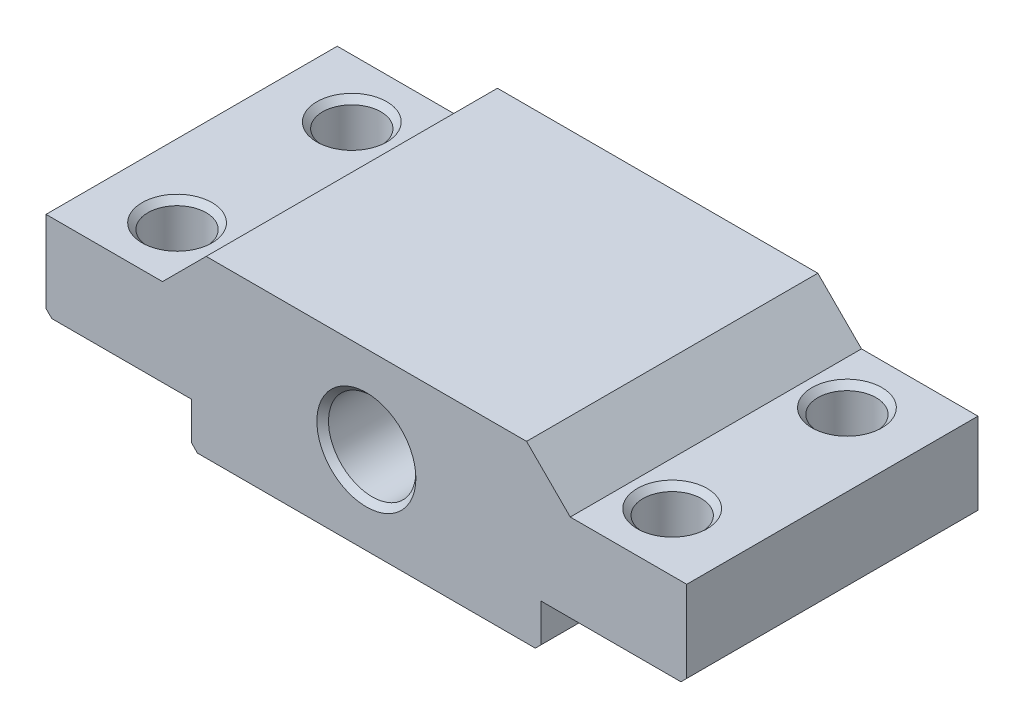
ISO-10303-21;
HEADER;
FILE_DESCRIPTION(('STEP AP214'),'2;1');
FILE_NAME('part.step','',(''),(''),'','','');
FILE_SCHEMA(('AUTOMOTIVE_DESIGN { 1 0 10303 214 1 1 1 1 }'));
ENDSEC;
DATA;
#1=APPLICATION_CONTEXT('core data for automotive mechanical design processes');
#2=APPLICATION_PROTOCOL_DEFINITION('international standard','automotive_design',2000,#1);
#3=PRODUCT_CONTEXT('',#1,'mechanical');
#4=PRODUCT('Part','Part','',(#3));
#5=PRODUCT_RELATED_PRODUCT_CATEGORY('part','',(#4));
#6=PRODUCT_DEFINITION_FORMATION('','',#4);
#7=PRODUCT_DEFINITION_CONTEXT('part definition',#1,'design');
#8=PRODUCT_DEFINITION('design','',#6,#7);
#9=PRODUCT_DEFINITION_SHAPE('','',#8);
#10=(LENGTH_UNIT() NAMED_UNIT(*) SI_UNIT(.MILLI.,.METRE.));
#11=(NAMED_UNIT(*) PLANE_ANGLE_UNIT() SI_UNIT($,.RADIAN.));
#12=(NAMED_UNIT(*) SI_UNIT($,.STERADIAN.) SOLID_ANGLE_UNIT());
#13=UNCERTAINTY_MEASURE_WITH_UNIT(LENGTH_MEASURE(1.E-05),#10,'distance_accuracy_value','');
#14=(GEOMETRIC_REPRESENTATION_CONTEXT(3) GLOBAL_UNCERTAINTY_ASSIGNED_CONTEXT((#13)) GLOBAL_UNIT_ASSIGNED_CONTEXT((#10,
#11,#12)) REPRESENTATION_CONTEXT('',''));
#15=CARTESIAN_POINT('',(0.,0.,0.));
#16=DIRECTION('',(0.,0.,1.));
#17=DIRECTION('',(1.,0.,0.));
#18=AXIS2_PLACEMENT_3D('',#15,#16,#17);
#19=CARTESIAN_POINT('',(-55.,7.5,25.));
#20=DIRECTION('',(0.,-1.,0.));
#21=DIRECTION('',(0.,0.,-1.));
#22=AXIS2_PLACEMENT_3D('',#19,#20,#21);
#23=PLANE('',#22);
#24=CARTESIAN_POINT('',(-42.5,7.5,-15.));
#25=DIRECTION('',(0.,-1.,0.));
#26=DIRECTION('',(0.,0.,-1.));
#27=AXIS2_PLACEMENT_3D('',#24,#25,#26);
#28=CIRCLE('',#27,6.00000000000002);
#29=CARTESIAN_POINT('',(-42.5,7.5,-21.));
#30=VERTEX_POINT('',#29);
#31=EDGE_CURVE('E278',#30,#30,#28,.T.);
#32=ORIENTED_EDGE('',*,*,#31,.T.);
#33=EDGE_LOOP('',(#32));
#34=FACE_BOUND('',#33,.T.);
#35=CARTESIAN_POINT('',(-42.5,7.5,15.));
#36=DIRECTION('',(0.,-1.,0.));
#37=DIRECTION('',(0.,0.,-1.));
#38=AXIS2_PLACEMENT_3D('',#35,#36,#37);
#39=CIRCLE('',#38,6.00000000000002);
#40=CARTESIAN_POINT('',(-42.5,7.5,8.99999999999998));
#41=VERTEX_POINT('',#40);
#42=EDGE_CURVE('E274',#41,#41,#39,.T.);
#43=ORIENTED_EDGE('',*,*,#42,.T.);
#44=EDGE_LOOP('',(#43));
#45=FACE_BOUND('',#44,.T.);
#46=DIRECTION('',(-1.,0.,0.));
#47=VECTOR('',#46,1.);
#48=CARTESIAN_POINT('',(-55.,7.5,25.));
#49=LINE('',#48,#47);
#50=CARTESIAN_POINT('',(-35.0000000000002,7.5,25.));
#51=VERTEX_POINT('',#50);
#52=CARTESIAN_POINT('',(-55.,7.5,25.));
#53=VERTEX_POINT('',#52);
#54=EDGE_CURVE('E163',#51,#53,#49,.T.);
#55=ORIENTED_EDGE('',*,*,#54,.F.);
#56=DIRECTION('',(0.,0.,-1.));
#57=VECTOR('',#56,1.);
#58=CARTESIAN_POINT('',(-35.0000000000002,7.5,-25.));
#59=LINE('',#58,#57);
#60=CARTESIAN_POINT('',(-35.0000000000002,7.5,-25.));
#61=VERTEX_POINT('',#60);
#62=EDGE_CURVE('E193',#51,#61,#59,.T.);
#63=ORIENTED_EDGE('',*,*,#62,.T.);
#64=DIRECTION('',(-1.,0.,0.));
#65=VECTOR('',#64,1.);
#66=CARTESIAN_POINT('',(-55.,7.5,-25.));
#67=LINE('',#66,#65);
#68=CARTESIAN_POINT('',(-55.,7.5,-25.));
#69=VERTEX_POINT('',#68);
#70=EDGE_CURVE('E185',#61,#69,#67,.T.);
#71=ORIENTED_EDGE('',*,*,#70,.T.);
#72=DIRECTION('',(0.,0.,-1.));
#73=VECTOR('',#72,1.);
#74=CARTESIAN_POINT('',(-55.,7.5,25.));
#75=LINE('',#74,#73);
#76=EDGE_CURVE('E177',#53,#69,#75,.T.);
#77=ORIENTED_EDGE('',*,*,#76,.F.);
#78=EDGE_LOOP('',(#55,#63,#71,#77));
#79=FACE_BOUND('',#78,.T.);
#80=ADVANCED_FACE('F47',(#34,#45,#79),#23,.F.);
#81=CARTESIAN_POINT('',(25.,7.5,25.));
#82=DIRECTION('',(0.,-1.,0.));
#83=DIRECTION('',(0.,0.,-1.));
#84=AXIS2_PLACEMENT_3D('',#81,#82,#83);
#85=PLANE('',#84);
#86=CARTESIAN_POINT('',(42.5,7.5,15.));
#87=DIRECTION('',(0.,-1.,0.));
#88=DIRECTION('',(0.,0.,-1.));
#89=AXIS2_PLACEMENT_3D('',#86,#87,#88);
#90=CIRCLE('',#89,6.00000000000002);
#91=CARTESIAN_POINT('',(42.5,7.5,8.99999999999998));
#92=VERTEX_POINT('',#91);
#93=EDGE_CURVE('E262',#92,#92,#90,.T.);
#94=ORIENTED_EDGE('',*,*,#93,.T.);
#95=EDGE_LOOP('',(#94));
#96=FACE_BOUND('',#95,.T.);
#97=CARTESIAN_POINT('',(42.5,7.5,-15.));
#98=DIRECTION('',(0.,-1.,0.));
#99=DIRECTION('',(0.,0.,-1.));
#100=AXIS2_PLACEMENT_3D('',#97,#98,#99);
#101=CIRCLE('',#100,6.00000000000002);
#102=CARTESIAN_POINT('',(42.5,7.5,-21.));
#103=VERTEX_POINT('',#102);
#104=EDGE_CURVE('E258',#103,#103,#101,.T.);
#105=ORIENTED_EDGE('',*,*,#104,.T.);
#106=EDGE_LOOP('',(#105));
#107=FACE_BOUND('',#106,.T.);
#108=DIRECTION('',(-1.,0.,0.));
#109=VECTOR('',#108,1.);
#110=CARTESIAN_POINT('',(25.,7.5,-25.));
#111=LINE('',#110,#109);
#112=CARTESIAN_POINT('',(55.,7.5,-25.));
#113=VERTEX_POINT('',#112);
#114=CARTESIAN_POINT('',(35.0000000000001,7.5,-25.));
#115=VERTEX_POINT('',#114);
#116=EDGE_CURVE('E458',#113,#115,#111,.T.);
#117=ORIENTED_EDGE('',*,*,#116,.T.);
#118=DIRECTION('',(0.,0.,1.));
#119=VECTOR('',#118,1.);
#120=CARTESIAN_POINT('',(35.0000000000001,7.5,25.));
#121=LINE('',#120,#119);
#122=CARTESIAN_POINT('',(35.0000000000001,7.5,25.));
#123=VERTEX_POINT('',#122);
#124=EDGE_CURVE('E188',#115,#123,#121,.T.);
#125=ORIENTED_EDGE('',*,*,#124,.T.);
#126=DIRECTION('',(-1.,0.,0.));
#127=VECTOR('',#126,1.);
#128=CARTESIAN_POINT('',(25.,7.5,25.));
#129=LINE('',#128,#127);
#130=CARTESIAN_POINT('',(55.,7.5,25.));
#131=VERTEX_POINT('',#130);
#132=EDGE_CURVE('E496',#131,#123,#129,.T.);
#133=ORIENTED_EDGE('',*,*,#132,.F.);
#134=DIRECTION('',(0.,0.,-1.));
#135=VECTOR('',#134,1.);
#136=CARTESIAN_POINT('',(55.,7.5,25.));
#137=LINE('',#136,#135);
#138=EDGE_CURVE('E464',#131,#113,#137,.T.);
#139=ORIENTED_EDGE('',*,*,#138,.T.);
#140=EDGE_LOOP('',(#117,#125,#133,#139));
#141=FACE_BOUND('',#140,.T.);
#142=ADVANCED_FACE('F305',(#96,#107,#141),#85,.F.);
#143=CARTESIAN_POINT('',(-55.,-6.5,25.));
#144=DIRECTION('',(1.,0.,0.));
#145=DIRECTION('',(0.,0.,-1.));
#146=AXIS2_PLACEMENT_3D('',#143,#144,#145);
#147=PLANE('',#146);
#148=DIRECTION('',(0.,-1.,0.));
#149=VECTOR('',#148,1.);
#150=CARTESIAN_POINT('',(-55.,-6.5,-25.));
#151=LINE('',#150,#149);
#152=CARTESIAN_POINT('',(-55.,-6.5,-25.));
#153=VERTEX_POINT('',#152);
#154=EDGE_CURVE('E531',#69,#153,#151,.T.);
#155=ORIENTED_EDGE('',*,*,#154,.T.);
#156=DIRECTION('',(0.,0.,-1.));
#157=VECTOR('',#156,1.);
#158=CARTESIAN_POINT('',(-55.,-6.5,25.));
#159=LINE('',#158,#157);
#160=CARTESIAN_POINT('',(-55.,-6.5,25.));
#161=VERTEX_POINT('',#160);
#162=EDGE_CURVE('E179',#161,#153,#159,.T.);
#163=ORIENTED_EDGE('',*,*,#162,.F.);
#164=DIRECTION('',(0.,-1.,0.));
#165=VECTOR('',#164,1.);
#166=CARTESIAN_POINT('',(-55.,-6.5,25.));
#167=LINE('',#166,#165);
#168=EDGE_CURVE('E166',#53,#161,#167,.T.);
#169=ORIENTED_EDGE('',*,*,#168,.F.);
#170=ORIENTED_EDGE('',*,*,#76,.T.);
#171=EDGE_LOOP('',(#155,#163,#169,#170));
#172=FACE_BOUND('',#171,.T.);
#173=ADVANCED_FACE('F176',(#172),#147,.F.);
#174=CARTESIAN_POINT('',(-54.,-7.5,25.));
#175=DIRECTION('',(0.707106781186549,0.707106781186546,0.));
#176=DIRECTION('',(-0.707106781186546,0.707106781186549,0.));
#177=AXIS2_PLACEMENT_3D('',#174,#175,#176);
#178=PLANE('',#177);
#179=DIRECTION('',(0.707106781186546,-0.707106781186549,0.));
#180=VECTOR('',#179,1.);
#181=CARTESIAN_POINT('',(-54.,-7.5,-25.));
#182=LINE('',#181,#180);
#183=CARTESIAN_POINT('',(-54.,-7.5,-25.));
#184=VERTEX_POINT('',#183);
#185=EDGE_CURVE('E422',#153,#184,#182,.T.);
#186=ORIENTED_EDGE('',*,*,#185,.T.);
#187=DIRECTION('',(0.,0.,-1.));
#188=VECTOR('',#187,1.);
#189=CARTESIAN_POINT('',(-54.,-7.5,25.));
#190=LINE('',#189,#188);
#191=CARTESIAN_POINT('',(-54.,-7.5,25.));
#192=VERTEX_POINT('',#191);
#193=EDGE_CURVE('E195',#192,#184,#190,.T.);
#194=ORIENTED_EDGE('',*,*,#193,.F.);
#195=DIRECTION('',(0.707106781186546,-0.707106781186549,0.));
#196=VECTOR('',#195,1.);
#197=CARTESIAN_POINT('',(-54.,-7.5,25.));
#198=LINE('',#197,#196);
#199=EDGE_CURVE('E182',#161,#192,#198,.T.);
#200=ORIENTED_EDGE('',*,*,#199,.F.);
#201=ORIENTED_EDGE('',*,*,#162,.T.);
#202=EDGE_LOOP('',(#186,#194,#200,#201));
#203=FACE_BOUND('',#202,.T.);
#204=ADVANCED_FACE('F405',(#203),#178,.F.);
#205=CARTESIAN_POINT('',(-30.,-7.5,25.));
#206=DIRECTION('',(0.,1.,0.));
#207=DIRECTION('',(-1.,0.,0.));
#208=AXIS2_PLACEMENT_3D('',#205,#206,#207);
#209=PLANE('',#208);
#210=CARTESIAN_POINT('',(-42.5,-7.5,-15.));
#211=DIRECTION('',(0.,1.,0.));
#212=DIRECTION('',(-1.,0.,0.));
#213=AXIS2_PLACEMENT_3D('',#210,#211,#212);
#214=CIRCLE('',#213,6.00000000000003);
#215=CARTESIAN_POINT('',(-48.5,-7.5,-15.));
#216=VERTEX_POINT('',#215);
#217=EDGE_CURVE('E286',#216,#216,#214,.T.);
#218=ORIENTED_EDGE('',*,*,#217,.T.);
#219=EDGE_LOOP('',(#218));
#220=FACE_BOUND('',#219,.T.);
#221=CARTESIAN_POINT('',(-42.5,-7.5,15.));
#222=DIRECTION('',(0.,1.,0.));
#223=DIRECTION('',(-1.,0.,0.));
#224=AXIS2_PLACEMENT_3D('',#221,#222,#223);
#225=CIRCLE('',#224,6.00000000000003);
#226=CARTESIAN_POINT('',(-48.5,-7.5,15.));
#227=VERTEX_POINT('',#226);
#228=EDGE_CURVE('E282',#227,#227,#225,.T.);
#229=ORIENTED_EDGE('',*,*,#228,.T.);
#230=EDGE_LOOP('',(#229));
#231=FACE_BOUND('',#230,.T.);
#232=DIRECTION('',(1.,0.,0.));
#233=VECTOR('',#232,1.);
#234=CARTESIAN_POINT('',(-30.,-7.5,-25.));
#235=LINE('',#234,#233);
#236=CARTESIAN_POINT('',(-30.,-7.5,-25.));
#237=VERTEX_POINT('',#236);
#238=EDGE_CURVE('E412',#184,#237,#235,.T.);
#239=ORIENTED_EDGE('',*,*,#238,.T.);
#240=DIRECTION('',(0.,0.,-1.));
#241=VECTOR('',#240,1.);
#242=CARTESIAN_POINT('',(-30.,-7.5,25.));
#243=LINE('',#242,#241);
#244=CARTESIAN_POINT('',(-30.,-7.5,25.));
#245=VERTEX_POINT('',#244);
#246=EDGE_CURVE('E415',#245,#237,#243,.T.);
#247=ORIENTED_EDGE('',*,*,#246,.F.);
#248=DIRECTION('',(1.,0.,0.));
#249=VECTOR('',#248,1.);
#250=CARTESIAN_POINT('',(-30.,-7.5,25.));
#251=LINE('',#250,#249);
#252=EDGE_CURVE('E523',#192,#245,#251,.T.);
#253=ORIENTED_EDGE('',*,*,#252,.F.);
#254=ORIENTED_EDGE('',*,*,#193,.T.);
#255=EDGE_LOOP('',(#239,#247,#253,#254));
#256=FACE_BOUND('',#255,.T.);
#257=ADVANCED_FACE('F402',(#220,#231,#256),#209,.F.);
#258=CARTESIAN_POINT('',(-30.,-14.,25.));
#259=DIRECTION('',(1.,0.,0.));
#260=DIRECTION('',(0.,0.,-1.));
#261=AXIS2_PLACEMENT_3D('',#258,#259,#260);
#262=PLANE('',#261);
#263=DIRECTION('',(0.,-1.,0.));
#264=VECTOR('',#263,1.);
#265=CARTESIAN_POINT('',(-30.,-14.,-25.));
#266=LINE('',#265,#264);
#267=CARTESIAN_POINT('',(-30.,-14.,-25.));
#268=VERTEX_POINT('',#267);
#269=EDGE_CURVE('E421',#237,#268,#266,.T.);
#270=ORIENTED_EDGE('',*,*,#269,.T.);
#271=DIRECTION('',(0.,0.,-1.));
#272=VECTOR('',#271,1.);
#273=CARTESIAN_POINT('',(-30.,-14.,25.));
#274=LINE('',#273,#272);
#275=CARTESIAN_POINT('',(-30.,-14.,25.));
#276=VERTEX_POINT('',#275);
#277=EDGE_CURVE('E429',#276,#268,#274,.T.);
#278=ORIENTED_EDGE('',*,*,#277,.F.);
#279=DIRECTION('',(0.,-1.,0.));
#280=VECTOR('',#279,1.);
#281=CARTESIAN_POINT('',(-30.,-14.,25.));
#282=LINE('',#281,#280);
#283=EDGE_CURVE('E427',#245,#276,#282,.T.);
#284=ORIENTED_EDGE('',*,*,#283,.F.);
#285=ORIENTED_EDGE('',*,*,#246,.T.);
#286=EDGE_LOOP('',(#270,#278,#284,#285));
#287=FACE_BOUND('',#286,.T.);
#288=ADVANCED_FACE('F404',(#287),#262,.F.);
#289=CARTESIAN_POINT('',(-29.,-15.,25.));
#290=DIRECTION('',(0.707106781186546,0.707106781186549,0.));
#291=DIRECTION('',(-0.707106781186549,0.707106781186546,0.));
#292=AXIS2_PLACEMENT_3D('',#289,#290,#291);
#293=PLANE('',#292);
#294=DIRECTION('',(0.707106781186549,-0.707106781186546,0.));
#295=VECTOR('',#294,1.);
#296=CARTESIAN_POINT('',(-29.,-15.,-25.));
#297=LINE('',#296,#295);
#298=CARTESIAN_POINT('',(-29.,-15.,-25.));
#299=VERTEX_POINT('',#298);
#300=EDGE_CURVE('E433',#268,#299,#297,.T.);
#301=ORIENTED_EDGE('',*,*,#300,.T.);
#302=DIRECTION('',(0.,0.,-1.));
#303=VECTOR('',#302,1.);
#304=CARTESIAN_POINT('',(-29.,-15.,25.));
#305=LINE('',#304,#303);
#306=CARTESIAN_POINT('',(-29.,-15.,25.));
#307=VERTEX_POINT('',#306);
#308=EDGE_CURVE('E488',#307,#299,#305,.T.);
#309=ORIENTED_EDGE('',*,*,#308,.F.);
#310=DIRECTION('',(0.707106781186549,-0.707106781186546,0.));
#311=VECTOR('',#310,1.);
#312=CARTESIAN_POINT('',(-29.,-15.,25.));
#313=LINE('',#312,#311);
#314=EDGE_CURVE('E518',#276,#307,#313,.T.);
#315=ORIENTED_EDGE('',*,*,#314,.F.);
#316=ORIENTED_EDGE('',*,*,#277,.T.);
#317=EDGE_LOOP('',(#301,#309,#315,#316));
#318=FACE_BOUND('',#317,.T.);
#319=ADVANCED_FACE('F575',(#318),#293,.F.);
#320=CARTESIAN_POINT('',(29.,-15.,25.));
#321=DIRECTION('',(0.,1.,0.));
#322=DIRECTION('',(0.,0.,1.));
#323=AXIS2_PLACEMENT_3D('',#320,#321,#322);
#324=PLANE('',#323);
#325=DIRECTION('',(1.,0.,0.));
#326=VECTOR('',#325,1.);
#327=CARTESIAN_POINT('',(29.,-15.,-25.));
#328=LINE('',#327,#326);
#329=CARTESIAN_POINT('',(29.,-15.,-25.));
#330=VERTEX_POINT('',#329);
#331=EDGE_CURVE('E437',#299,#330,#328,.T.);
#332=ORIENTED_EDGE('',*,*,#331,.T.);
#333=DIRECTION('',(0.,0.,-1.));
#334=VECTOR('',#333,1.);
#335=CARTESIAN_POINT('',(29.,-15.,25.));
#336=LINE('',#335,#334);
#337=CARTESIAN_POINT('',(29.,-15.,25.));
#338=VERTEX_POINT('',#337);
#339=EDGE_CURVE('E484',#338,#330,#336,.T.);
#340=ORIENTED_EDGE('',*,*,#339,.F.);
#341=DIRECTION('',(1.,0.,0.));
#342=VECTOR('',#341,1.);
#343=CARTESIAN_POINT('',(29.,-15.,25.));
#344=LINE('',#343,#342);
#345=EDGE_CURVE('E515',#307,#338,#344,.T.);
#346=ORIENTED_EDGE('',*,*,#345,.F.);
#347=ORIENTED_EDGE('',*,*,#308,.T.);
#348=EDGE_LOOP('',(#332,#340,#346,#347));
#349=FACE_BOUND('',#348,.T.);
#350=ADVANCED_FACE('F571',(#349),#324,.F.);
#351=CARTESIAN_POINT('',(30.,-14.,25.));
#352=DIRECTION('',(-0.707106781186549,0.707106781186546,0.));
#353=DIRECTION('',(-0.707106781186546,-0.707106781186549,0.));
#354=AXIS2_PLACEMENT_3D('',#351,#352,#353);
#355=PLANE('',#354);
#356=DIRECTION('',(0.707106781186546,0.707106781186549,0.));
#357=VECTOR('',#356,1.);
#358=CARTESIAN_POINT('',(30.,-14.,-25.));
#359=LINE('',#358,#357);
#360=CARTESIAN_POINT('',(30.,-14.,-25.));
#361=VERTEX_POINT('',#360);
#362=EDGE_CURVE('E443',#330,#361,#359,.T.);
#363=ORIENTED_EDGE('',*,*,#362,.T.);
#364=DIRECTION('',(0.,0.,-1.));
#365=VECTOR('',#364,1.);
#366=CARTESIAN_POINT('',(30.,-14.,25.));
#367=LINE('',#366,#365);
#368=CARTESIAN_POINT('',(30.,-14.,25.));
#369=VERTEX_POINT('',#368);
#370=EDGE_CURVE('E480',#369,#361,#367,.T.);
#371=ORIENTED_EDGE('',*,*,#370,.F.);
#372=DIRECTION('',(0.707106781186546,0.707106781186549,0.));
#373=VECTOR('',#372,1.);
#374=CARTESIAN_POINT('',(30.,-14.,25.));
#375=LINE('',#374,#373);
#376=EDGE_CURVE('E512',#338,#369,#375,.T.);
#377=ORIENTED_EDGE('',*,*,#376,.F.);
#378=ORIENTED_EDGE('',*,*,#339,.T.);
#379=EDGE_LOOP('',(#363,#371,#377,#378));
#380=FACE_BOUND('',#379,.T.);
#381=ADVANCED_FACE('F566',(#380),#355,.F.);
#382=CARTESIAN_POINT('',(30.,-7.5,25.));
#383=DIRECTION('',(-1.,0.,0.));
#384=DIRECTION('',(0.,0.,1.));
#385=AXIS2_PLACEMENT_3D('',#382,#383,#384);
#386=PLANE('',#385);
#387=DIRECTION('',(0.,1.,0.));
#388=VECTOR('',#387,1.);
#389=CARTESIAN_POINT('',(30.,-7.5,-25.));
#390=LINE('',#389,#388);
#391=CARTESIAN_POINT('',(30.,-7.5,-25.));
#392=VERTEX_POINT('',#391);
#393=EDGE_CURVE('E446',#361,#392,#390,.T.);
#394=ORIENTED_EDGE('',*,*,#393,.T.);
#395=DIRECTION('',(0.,0.,-1.));
#396=VECTOR('',#395,1.);
#397=CARTESIAN_POINT('',(30.,-7.5,25.));
#398=LINE('',#397,#396);
#399=CARTESIAN_POINT('',(30.,-7.5,25.));
#400=VERTEX_POINT('',#399);
#401=EDGE_CURVE('E476',#400,#392,#398,.T.);
#402=ORIENTED_EDGE('',*,*,#401,.F.);
#403=DIRECTION('',(0.,1.,0.));
#404=VECTOR('',#403,1.);
#405=CARTESIAN_POINT('',(30.,-7.5,25.));
#406=LINE('',#405,#404);
#407=EDGE_CURVE('E509',#369,#400,#406,.T.);
#408=ORIENTED_EDGE('',*,*,#407,.F.);
#409=ORIENTED_EDGE('',*,*,#370,.T.);
#410=EDGE_LOOP('',(#394,#402,#408,#409));
#411=FACE_BOUND('',#410,.T.);
#412=ADVANCED_FACE('F562',(#411),#386,.F.);
#413=CARTESIAN_POINT('',(54.,-7.5,25.));
#414=DIRECTION('',(0.,1.,0.));
#415=DIRECTION('',(-1.,0.,0.));
#416=AXIS2_PLACEMENT_3D('',#413,#414,#415);
#417=PLANE('',#416);
#418=CARTESIAN_POINT('',(42.5,-7.5,-15.));
#419=DIRECTION('',(0.,1.,0.));
#420=DIRECTION('',(-1.,0.,0.));
#421=AXIS2_PLACEMENT_3D('',#418,#419,#420);
#422=CIRCLE('',#421,6.00000000000003);
#423=CARTESIAN_POINT('',(36.5,-7.5,-15.));
#424=VERTEX_POINT('',#423);
#425=EDGE_CURVE('E238',#424,#424,#422,.T.);
#426=ORIENTED_EDGE('',*,*,#425,.T.);
#427=EDGE_LOOP('',(#426));
#428=FACE_BOUND('',#427,.T.);
#429=CARTESIAN_POINT('',(42.5,-7.5,15.));
#430=DIRECTION('',(0.,1.,0.));
#431=DIRECTION('',(-1.,0.,0.));
#432=AXIS2_PLACEMENT_3D('',#429,#430,#431);
#433=CIRCLE('',#432,6.00000000000003);
#434=CARTESIAN_POINT('',(36.5,-7.5,15.));
#435=VERTEX_POINT('',#434);
#436=EDGE_CURVE('E234',#435,#435,#433,.T.);
#437=ORIENTED_EDGE('',*,*,#436,.T.);
#438=EDGE_LOOP('',(#437));
#439=FACE_BOUND('',#438,.T.);
#440=DIRECTION('',(1.,0.,0.));
#441=VECTOR('',#440,1.);
#442=CARTESIAN_POINT('',(54.,-7.5,-25.));
#443=LINE('',#442,#441);
#444=CARTESIAN_POINT('',(54.,-7.5,-25.));
#445=VERTEX_POINT('',#444);
#446=EDGE_CURVE('E449',#392,#445,#443,.T.);
#447=ORIENTED_EDGE('',*,*,#446,.T.);
#448=DIRECTION('',(0.,0.,-1.));
#449=VECTOR('',#448,1.);
#450=CARTESIAN_POINT('',(54.,-7.5,25.));
#451=LINE('',#450,#449);
#452=CARTESIAN_POINT('',(54.,-7.5,25.));
#453=VERTEX_POINT('',#452);
#454=EDGE_CURVE('E472',#453,#445,#451,.T.);
#455=ORIENTED_EDGE('',*,*,#454,.F.);
#456=DIRECTION('',(1.,0.,0.));
#457=VECTOR('',#456,1.);
#458=CARTESIAN_POINT('',(54.,-7.5,25.));
#459=LINE('',#458,#457);
#460=EDGE_CURVE('E506',#400,#453,#459,.T.);
#461=ORIENTED_EDGE('',*,*,#460,.F.);
#462=ORIENTED_EDGE('',*,*,#401,.T.);
#463=EDGE_LOOP('',(#447,#455,#461,#462));
#464=FACE_BOUND('',#463,.T.);
#465=ADVANCED_FACE('F558',(#428,#439,#464),#417,.F.);
#466=CARTESIAN_POINT('',(55.,-6.5,25.));
#467=DIRECTION('',(-0.707106781186551,0.707106781186544,0.));
#468=DIRECTION('',(-0.707106781186544,-0.707106781186551,0.));
#469=AXIS2_PLACEMENT_3D('',#466,#467,#468);
#470=PLANE('',#469);
#471=DIRECTION('',(0.707106781186544,0.707106781186551,0.));
#472=VECTOR('',#471,1.);
#473=CARTESIAN_POINT('',(55.,-6.5,-25.));
#474=LINE('',#473,#472);
#475=CARTESIAN_POINT('',(55.,-6.5,-25.));
#476=VERTEX_POINT('',#475);
#477=EDGE_CURVE('E452',#445,#476,#474,.T.);
#478=ORIENTED_EDGE('',*,*,#477,.T.);
#479=DIRECTION('',(0.,0.,-1.));
#480=VECTOR('',#479,1.);
#481=CARTESIAN_POINT('',(55.,-6.5,25.));
#482=LINE('',#481,#480);
#483=CARTESIAN_POINT('',(55.,-6.5,25.));
#484=VERTEX_POINT('',#483);
#485=EDGE_CURVE('E468',#484,#476,#482,.T.);
#486=ORIENTED_EDGE('',*,*,#485,.F.);
#487=DIRECTION('',(0.707106781186544,0.707106781186551,0.));
#488=VECTOR('',#487,1.);
#489=CARTESIAN_POINT('',(55.,-6.5,25.));
#490=LINE('',#489,#488);
#491=EDGE_CURVE('E503',#453,#484,#490,.T.);
#492=ORIENTED_EDGE('',*,*,#491,.F.);
#493=ORIENTED_EDGE('',*,*,#454,.T.);
#494=EDGE_LOOP('',(#478,#486,#492,#493));
#495=FACE_BOUND('',#494,.T.);
#496=ADVANCED_FACE('F553',(#495),#470,.F.);
#497=CARTESIAN_POINT('',(55.,7.5,25.));
#498=DIRECTION('',(-1.,0.,0.));
#499=DIRECTION('',(0.,0.,1.));
#500=AXIS2_PLACEMENT_3D('',#497,#498,#499);
#501=PLANE('',#500);
#502=DIRECTION('',(0.,1.,0.));
#503=VECTOR('',#502,1.);
#504=CARTESIAN_POINT('',(55.,7.5,-25.));
#505=LINE('',#504,#503);
#506=EDGE_CURVE('E455',#476,#113,#505,.T.);
#507=ORIENTED_EDGE('',*,*,#506,.T.);
#508=ORIENTED_EDGE('',*,*,#138,.F.);
#509=DIRECTION('',(0.,1.,0.));
#510=VECTOR('',#509,1.);
#511=CARTESIAN_POINT('',(55.,7.5,25.));
#512=LINE('',#511,#510);
#513=EDGE_CURVE('E500',#484,#131,#512,.T.);
#514=ORIENTED_EDGE('',*,*,#513,.F.);
#515=ORIENTED_EDGE('',*,*,#485,.T.);
#516=EDGE_LOOP('',(#507,#508,#514,#515));
#517=FACE_BOUND('',#516,.T.);
#518=ADVANCED_FACE('F547',(#517),#501,.F.);
#519=CARTESIAN_POINT('',(-25.,15.,25.));
#520=DIRECTION('',(0.,-1.,0.));
#521=DIRECTION('',(0.,0.,-1.));
#522=AXIS2_PLACEMENT_3D('',#519,#520,#521);
#523=PLANE('',#522);
#524=DIRECTION('',(-1.,0.,0.));
#525=VECTOR('',#524,1.);
#526=CARTESIAN_POINT('',(-25.,15.,-25.));
#527=LINE('',#526,#525);
#528=CARTESIAN_POINT('',(27.5000000000002,15.,-25.));
#529=VERTEX_POINT('',#528);
#530=CARTESIAN_POINT('',(-27.5000000000001,15.,-25.));
#531=VERTEX_POINT('',#530);
#532=EDGE_CURVE('E79',#529,#531,#527,.T.);
#533=ORIENTED_EDGE('',*,*,#532,.T.);
#534=DIRECTION('',(0.,0.,-1.));
#535=VECTOR('',#534,1.);
#536=CARTESIAN_POINT('',(-27.5000000000001,15.,25.));
#537=LINE('',#536,#535);
#538=CARTESIAN_POINT('',(-27.5000000000001,15.,25.));
#539=VERTEX_POINT('',#538);
#540=EDGE_CURVE('E213',#531,#539,#537,.F.);
#541=ORIENTED_EDGE('',*,*,#540,.T.);
#542=DIRECTION('',(-1.,0.,0.));
#543=VECTOR('',#542,1.);
#544=CARTESIAN_POINT('',(-25.,15.,25.));
#545=LINE('',#544,#543);
#546=CARTESIAN_POINT('',(27.5000000000002,15.,25.));
#547=VERTEX_POINT('',#546);
#548=EDGE_CURVE('E65',#547,#539,#545,.T.);
#549=ORIENTED_EDGE('',*,*,#548,.F.);
#550=DIRECTION('',(0.,0.,1.));
#551=VECTOR('',#550,1.);
#552=CARTESIAN_POINT('',(27.5000000000002,15.,25.));
#553=LINE('',#552,#551);
#554=EDGE_CURVE('E201',#547,#529,#553,.F.);
#555=ORIENTED_EDGE('',*,*,#554,.T.);
#556=EDGE_LOOP('',(#533,#541,#549,#555));
#557=FACE_BOUND('',#556,.T.);
#558=ADVANCED_FACE('F536',(#557),#523,.F.);
#559=CARTESIAN_POINT('',(0.,0.,25.));
#560=DIRECTION('',(0.,0.,1.));
#561=DIRECTION('',(1.,0.,0.));
#562=AXIS2_PLACEMENT_3D('',#559,#560,#561);
#563=PLANE('',#562);
#564=CARTESIAN_POINT('',(0.,0.,25.));
#565=DIRECTION('',(0.,0.,1.));
#566=DIRECTION('',(1.,0.,0.));
#567=AXIS2_PLACEMENT_3D('',#564,#565,#566);
#568=CIRCLE('',#567,8.50000000000004);
#569=CARTESIAN_POINT('',(8.50000000000004,0.,25.));
#570=VERTEX_POINT('',#569);
#571=EDGE_CURVE('E230',#570,#570,#568,.F.);
#572=ORIENTED_EDGE('',*,*,#571,.T.);
#573=EDGE_LOOP('',(#572));
#574=FACE_BOUND('',#573,.T.);
#575=ORIENTED_EDGE('',*,*,#548,.T.);
#576=DIRECTION('',(0.707106781186551,0.707106781186544,0.));
#577=VECTOR('',#576,1.);
#578=CARTESIAN_POINT('',(-35.0000000000002,7.5,25.));
#579=LINE('',#578,#577);
#580=EDGE_CURVE('E83',#539,#51,#579,.F.);
#581=ORIENTED_EDGE('',*,*,#580,.T.);
#582=ORIENTED_EDGE('',*,*,#54,.T.);
#583=ORIENTED_EDGE('',*,*,#168,.T.);
#584=ORIENTED_EDGE('',*,*,#199,.T.);
#585=ORIENTED_EDGE('',*,*,#252,.T.);
#586=ORIENTED_EDGE('',*,*,#283,.T.);
#587=ORIENTED_EDGE('',*,*,#314,.T.);
#588=ORIENTED_EDGE('',*,*,#345,.T.);
#589=ORIENTED_EDGE('',*,*,#376,.T.);
#590=ORIENTED_EDGE('',*,*,#407,.T.);
#591=ORIENTED_EDGE('',*,*,#460,.T.);
#592=ORIENTED_EDGE('',*,*,#491,.T.);
#593=ORIENTED_EDGE('',*,*,#513,.T.);
#594=ORIENTED_EDGE('',*,*,#132,.T.);
#595=DIRECTION('',(0.707106781186544,-0.707106781186551,0.));
#596=VECTOR('',#595,1.);
#597=CARTESIAN_POINT('',(25.,17.5000000000002,25.));
#598=LINE('',#597,#596);
#599=EDGE_CURVE('E207',#123,#547,#598,.F.);
#600=ORIENTED_EDGE('',*,*,#599,.T.);
#601=EDGE_LOOP('',(#575,#581,#582,#583,#584,#585,#586,#587,#588,#589,#590,#591,#592,#593,#594,#600));
#602=FACE_BOUND('',#601,.T.);
#603=ADVANCED_FACE('F165',(#574,#602),#563,.T.);
#604=CARTESIAN_POINT('',(0.,0.,-25.));
#605=DIRECTION('',(0.,0.,1.));
#606=DIRECTION('',(1.,0.,0.));
#607=AXIS2_PLACEMENT_3D('',#604,#605,#606);
#608=PLANE('',#607);
#609=CARTESIAN_POINT('',(0.,0.,-25.));
#610=DIRECTION('',(0.,0.,1.));
#611=DIRECTION('',(1.,0.,0.));
#612=AXIS2_PLACEMENT_3D('',#609,#610,#611);
#613=CIRCLE('',#612,8.50000000000004);
#614=CARTESIAN_POINT('',(8.50000000000004,0.,-25.));
#615=VERTEX_POINT('',#614);
#616=EDGE_CURVE('E218',#615,#615,#613,.T.);
#617=ORIENTED_EDGE('',*,*,#616,.T.);
#618=EDGE_LOOP('',(#617));
#619=FACE_BOUND('',#618,.T.);
#620=ORIENTED_EDGE('',*,*,#70,.F.);
#621=DIRECTION('',(-0.707106781186551,-0.707106781186544,0.));
#622=VECTOR('',#621,1.);
#623=CARTESIAN_POINT('',(-21.2499999999999,21.2500000000001,-25.));
#624=LINE('',#623,#622);
#625=EDGE_CURVE('E210',#61,#531,#624,.F.);
#626=ORIENTED_EDGE('',*,*,#625,.T.);
#627=ORIENTED_EDGE('',*,*,#532,.F.);
#628=DIRECTION('',(-0.707106781186544,0.707106781186551,0.));
#629=VECTOR('',#628,1.);
#630=CARTESIAN_POINT('',(21.2500000000002,21.25,-25.));
#631=LINE('',#630,#629);
#632=EDGE_CURVE('E204',#529,#115,#631,.F.);
#633=ORIENTED_EDGE('',*,*,#632,.T.);
#634=ORIENTED_EDGE('',*,*,#116,.F.);
#635=ORIENTED_EDGE('',*,*,#506,.F.);
#636=ORIENTED_EDGE('',*,*,#477,.F.);
#637=ORIENTED_EDGE('',*,*,#446,.F.);
#638=ORIENTED_EDGE('',*,*,#393,.F.);
#639=ORIENTED_EDGE('',*,*,#362,.F.);
#640=ORIENTED_EDGE('',*,*,#331,.F.);
#641=ORIENTED_EDGE('',*,*,#300,.F.);
#642=ORIENTED_EDGE('',*,*,#269,.F.);
#643=ORIENTED_EDGE('',*,*,#238,.F.);
#644=ORIENTED_EDGE('',*,*,#185,.F.);
#645=ORIENTED_EDGE('',*,*,#154,.F.);
#646=EDGE_LOOP('',(#620,#626,#627,#633,#634,#635,#636,#637,#638,#639,#640,#641,#642,#643,#644,#645));
#647=FACE_BOUND('',#646,.T.);
#648=ADVANCED_FACE('F327',(#619,#647),#608,.F.);
#649=CARTESIAN_POINT('',(25.,17.5000000000002,25.));
#650=DIRECTION('',(0.707106781186551,0.707106781186544,0.));
#651=DIRECTION('',(0.,0.,1.));
#652=AXIS2_PLACEMENT_3D('',#649,#650,#651);
#653=PLANE('',#652);
#654=ORIENTED_EDGE('',*,*,#599,.F.);
#655=ORIENTED_EDGE('',*,*,#124,.F.);
#656=ORIENTED_EDGE('',*,*,#632,.F.);
#657=ORIENTED_EDGE('',*,*,#554,.F.);
#658=EDGE_LOOP('',(#654,#655,#656,#657));
#659=FACE_BOUND('',#658,.T.);
#660=ADVANCED_FACE('F320',(#659),#653,.T.);
#661=CARTESIAN_POINT('',(-35.0000000000002,7.5,25.));
#662=DIRECTION('',(-0.707106781186544,0.707106781186551,0.));
#663=DIRECTION('',(0.,0.,1.));
#664=AXIS2_PLACEMENT_3D('',#661,#662,#663);
#665=PLANE('',#664);
#666=ORIENTED_EDGE('',*,*,#580,.F.);
#667=ORIENTED_EDGE('',*,*,#540,.F.);
#668=ORIENTED_EDGE('',*,*,#625,.F.);
#669=ORIENTED_EDGE('',*,*,#62,.F.);
#670=EDGE_LOOP('',(#666,#667,#668,#669));
#671=FACE_BOUND('',#670,.T.);
#672=ADVANCED_FACE('F326',(#671),#665,.T.);
#673=CARTESIAN_POINT('',(0.,0.,25.));
#674=DIRECTION('',(0.,0.,1.));
#675=DIRECTION('',(1.,0.,0.));
#676=AXIS2_PLACEMENT_3D('',#673,#674,#675);
#677=CYLINDRICAL_SURFACE('',#676,7.50000000000001);
#678=CARTESIAN_POINT('',(0.,0.,-24.));
#679=DIRECTION('',(0.,0.,1.));
#680=DIRECTION('',(1.,0.,0.));
#681=AXIS2_PLACEMENT_3D('',#678,#679,#680);
#682=CIRCLE('',#681,7.50000000000001);
#683=CARTESIAN_POINT('',(7.50000000000001,0.,-24.));
#684=VERTEX_POINT('',#683);
#685=EDGE_CURVE('E226',#684,#684,#682,.F.);
#686=ORIENTED_EDGE('',*,*,#685,.T.);
#687=EDGE_LOOP('',(#686));
#688=FACE_BOUND('',#687,.T.);
#689=CARTESIAN_POINT('',(0.,0.,24.));
#690=DIRECTION('',(0.,0.,1.));
#691=DIRECTION('',(1.,0.,0.));
#692=AXIS2_PLACEMENT_3D('',#689,#690,#691);
#693=CIRCLE('',#692,7.50000000000001);
#694=CARTESIAN_POINT('',(7.50000000000001,0.,24.));
#695=VERTEX_POINT('',#694);
#696=EDGE_CURVE('E222',#695,#695,#693,.T.);
#697=ORIENTED_EDGE('',*,*,#696,.T.);
#698=EDGE_LOOP('',(#697));
#699=FACE_BOUND('',#698,.T.);
#700=ADVANCED_FACE('F334',(#688,#699),#677,.F.);
#701=CARTESIAN_POINT('',(0.,0.,-25.));
#702=DIRECTION('',(0.,0.,-1.));
#703=DIRECTION('',(-1.,0.,0.));
#704=AXIS2_PLACEMENT_3D('',#701,#702,#703);
#705=CONICAL_SURFACE('',#704,8.50000000000004,0.785398163397447);
#706=ORIENTED_EDGE('',*,*,#685,.F.);
#707=EDGE_LOOP('',(#706));
#708=FACE_BOUND('',#707,.T.);
#709=ORIENTED_EDGE('',*,*,#616,.F.);
#710=EDGE_LOOP('',(#709));
#711=FACE_BOUND('',#710,.T.);
#712=ADVANCED_FACE('F336',(#708,#711),#705,.F.);
#713=CARTESIAN_POINT('',(0.,0.,24.));
#714=DIRECTION('',(0.,0.,1.));
#715=DIRECTION('',(1.,0.,0.));
#716=AXIS2_PLACEMENT_3D('',#713,#714,#715);
#717=CONICAL_SURFACE('',#716,7.50000000000001,0.78539816339745);
#718=ORIENTED_EDGE('',*,*,#571,.F.);
#719=EDGE_LOOP('',(#718));
#720=FACE_BOUND('',#719,.T.);
#721=ORIENTED_EDGE('',*,*,#696,.F.);
#722=EDGE_LOOP('',(#721));
#723=FACE_BOUND('',#722,.T.);
#724=ADVANCED_FACE('F342',(#720,#723),#717,.F.);
#725=CARTESIAN_POINT('',(42.5,7.5,15.));
#726=DIRECTION('',(0.,1.,0.));
#727=DIRECTION('',(0.,0.,1.));
#728=AXIS2_PLACEMENT_3D('',#725,#726,#727);
#729=CYLINDRICAL_SURFACE('',#728,5.00000000000001);
#730=CARTESIAN_POINT('',(42.5,-6.49999999999997,15.));
#731=DIRECTION('',(0.,1.,0.));
#732=DIRECTION('',(0.,0.,1.));
#733=AXIS2_PLACEMENT_3D('',#730,#731,#732);
#734=CIRCLE('',#733,5.00000000000001);
#735=CARTESIAN_POINT('',(42.5,-6.49999999999997,20.));
#736=VERTEX_POINT('',#735);
#737=EDGE_CURVE('E254',#736,#736,#734,.F.);
#738=ORIENTED_EDGE('',*,*,#737,.T.);
#739=EDGE_LOOP('',(#738));
#740=FACE_BOUND('',#739,.T.);
#741=CARTESIAN_POINT('',(42.5,6.5,15.));
#742=DIRECTION('',(0.,-1.,0.));
#743=DIRECTION('',(0.,0.,-1.));
#744=AXIS2_PLACEMENT_3D('',#741,#742,#743);
#745=CIRCLE('',#744,5.00000000000001);
#746=CARTESIAN_POINT('',(42.5,6.5,9.99999999999999));
#747=VERTEX_POINT('',#746);
#748=EDGE_CURVE('E250',#747,#747,#745,.F.);
#749=ORIENTED_EDGE('',*,*,#748,.T.);
#750=EDGE_LOOP('',(#749));
#751=FACE_BOUND('',#750,.T.);
#752=ADVANCED_FACE('F349',(#740,#751),#729,.F.);
#753=CARTESIAN_POINT('',(42.5,7.5,-15.));
#754=DIRECTION('',(0.,1.,0.));
#755=DIRECTION('',(0.,0.,1.));
#756=AXIS2_PLACEMENT_3D('',#753,#754,#755);
#757=CYLINDRICAL_SURFACE('',#756,5.00000000000001);
#758=CARTESIAN_POINT('',(42.5,-6.49999999999997,-15.));
#759=DIRECTION('',(0.,1.,0.));
#760=DIRECTION('',(0.,0.,1.));
#761=AXIS2_PLACEMENT_3D('',#758,#759,#760);
#762=CIRCLE('',#761,5.00000000000001);
#763=CARTESIAN_POINT('',(42.5,-6.49999999999997,-9.99999999999999));
#764=VERTEX_POINT('',#763);
#765=EDGE_CURVE('E246',#764,#764,#762,.F.);
#766=ORIENTED_EDGE('',*,*,#765,.T.);
#767=EDGE_LOOP('',(#766));
#768=FACE_BOUND('',#767,.T.);
#769=CARTESIAN_POINT('',(42.5,6.5,-15.));
#770=DIRECTION('',(0.,-1.,0.));
#771=DIRECTION('',(0.,0.,-1.));
#772=AXIS2_PLACEMENT_3D('',#769,#770,#771);
#773=CIRCLE('',#772,5.00000000000001);
#774=CARTESIAN_POINT('',(42.5,6.5,-20.));
#775=VERTEX_POINT('',#774);
#776=EDGE_CURVE('E242',#775,#775,#773,.F.);
#777=ORIENTED_EDGE('',*,*,#776,.T.);
#778=EDGE_LOOP('',(#777));
#779=FACE_BOUND('',#778,.T.);
#780=ADVANCED_FACE('F358',(#768,#779),#757,.F.);
#781=CARTESIAN_POINT('',(42.5,-7.5,-15.));
#782=DIRECTION('',(0.,-1.,0.));
#783=DIRECTION('',(0.,0.,-1.));
#784=AXIS2_PLACEMENT_3D('',#781,#782,#783);
#785=CONICAL_SURFACE('',#784,6.00000000000003,0.785398163397447);
#786=ORIENTED_EDGE('',*,*,#765,.F.);
#787=EDGE_LOOP('',(#786));
#788=FACE_BOUND('',#787,.T.);
#789=ORIENTED_EDGE('',*,*,#425,.F.);
#790=EDGE_LOOP('',(#789));
#791=FACE_BOUND('',#790,.T.);
#792=ADVANCED_FACE('F351',(#788,#791),#785,.F.);
#793=CARTESIAN_POINT('',(42.5,-7.5,15.));
#794=DIRECTION('',(0.,-1.,0.));
#795=DIRECTION('',(0.,0.,-1.));
#796=AXIS2_PLACEMENT_3D('',#793,#794,#795);
#797=CONICAL_SURFACE('',#796,6.00000000000003,0.785398163397447);
#798=ORIENTED_EDGE('',*,*,#737,.F.);
#799=EDGE_LOOP('',(#798));
#800=FACE_BOUND('',#799,.T.);
#801=ORIENTED_EDGE('',*,*,#436,.F.);
#802=EDGE_LOOP('',(#801));
#803=FACE_BOUND('',#802,.T.);
#804=ADVANCED_FACE('F357',(#800,#803),#797,.F.);
#805=CARTESIAN_POINT('',(42.5,6.5,15.));
#806=DIRECTION('',(0.,1.,0.));
#807=DIRECTION('',(0.,0.,1.));
#808=AXIS2_PLACEMENT_3D('',#805,#806,#807);
#809=CONICAL_SURFACE('',#808,5.00000000000001,0.785398163397453);
#810=ORIENTED_EDGE('',*,*,#93,.F.);
#811=EDGE_LOOP('',(#810));
#812=FACE_BOUND('',#811,.T.);
#813=ORIENTED_EDGE('',*,*,#748,.F.);
#814=EDGE_LOOP('',(#813));
#815=FACE_BOUND('',#814,.T.);
#816=ADVANCED_FACE('F365',(#812,#815),#809,.F.);
#817=CARTESIAN_POINT('',(42.5,6.5,-15.));
#818=DIRECTION('',(0.,1.,0.));
#819=DIRECTION('',(0.,0.,1.));
#820=AXIS2_PLACEMENT_3D('',#817,#818,#819);
#821=CONICAL_SURFACE('',#820,5.00000000000001,0.785398163397453);
#822=ORIENTED_EDGE('',*,*,#104,.F.);
#823=EDGE_LOOP('',(#822));
#824=FACE_BOUND('',#823,.T.);
#825=ORIENTED_EDGE('',*,*,#776,.F.);
#826=EDGE_LOOP('',(#825));
#827=FACE_BOUND('',#826,.T.);
#828=ADVANCED_FACE('F372',(#824,#827),#821,.F.);
#829=CARTESIAN_POINT('',(-42.5,7.5,15.));
#830=DIRECTION('',(0.,1.,0.));
#831=DIRECTION('',(0.,0.,1.));
#832=AXIS2_PLACEMENT_3D('',#829,#830,#831);
#833=CYLINDRICAL_SURFACE('',#832,5.00000000000001);
#834=CARTESIAN_POINT('',(-42.5,-6.49999999999997,15.));
#835=DIRECTION('',(0.,1.,0.));
#836=DIRECTION('',(0.,0.,1.));
#837=AXIS2_PLACEMENT_3D('',#834,#835,#836);
#838=CIRCLE('',#837,5.00000000000001);
#839=CARTESIAN_POINT('',(-42.5,-6.49999999999997,20.));
#840=VERTEX_POINT('',#839);
#841=EDGE_CURVE('E11',#840,#840,#838,.F.);
#842=ORIENTED_EDGE('',*,*,#841,.T.);
#843=EDGE_LOOP('',(#842));
#844=FACE_BOUND('',#843,.T.);
#845=CARTESIAN_POINT('',(-42.5,6.5,15.));
#846=DIRECTION('',(0.,-1.,0.));
#847=DIRECTION('',(0.,0.,-1.));
#848=AXIS2_PLACEMENT_3D('',#845,#846,#847);
#849=CIRCLE('',#848,5.00000000000001);
#850=CARTESIAN_POINT('',(-42.5,6.5,9.99999999999999));
#851=VERTEX_POINT('',#850);
#852=EDGE_CURVE('E58',#851,#851,#849,.F.);
#853=ORIENTED_EDGE('',*,*,#852,.T.);
#854=EDGE_LOOP('',(#853));
#855=FACE_BOUND('',#854,.T.);
#856=ADVANCED_FACE('F293',(#844,#855),#833,.F.);
#857=CARTESIAN_POINT('',(-42.5,7.5,-15.));
#858=DIRECTION('',(0.,1.,0.));
#859=DIRECTION('',(0.,0.,1.));
#860=AXIS2_PLACEMENT_3D('',#857,#858,#859);
#861=CYLINDRICAL_SURFACE('',#860,5.00000000000001);
#862=CARTESIAN_POINT('',(-42.5,6.5,-15.));
#863=DIRECTION('',(0.,-1.,0.));
#864=DIRECTION('',(0.,0.,-1.));
#865=AXIS2_PLACEMENT_3D('',#862,#863,#864);
#866=CIRCLE('',#865,5.00000000000001);
#867=CARTESIAN_POINT('',(-42.5,6.5,-20.));
#868=VERTEX_POINT('',#867);
#869=EDGE_CURVE('E270',#868,#868,#866,.F.);
#870=ORIENTED_EDGE('',*,*,#869,.T.);
#871=EDGE_LOOP('',(#870));
#872=FACE_BOUND('',#871,.T.);
#873=CARTESIAN_POINT('',(-42.5,-6.49999999999997,-15.));
#874=DIRECTION('',(0.,1.,0.));
#875=DIRECTION('',(0.,0.,1.));
#876=AXIS2_PLACEMENT_3D('',#873,#874,#875);
#877=CIRCLE('',#876,5.00000000000001);
#878=CARTESIAN_POINT('',(-42.5,-6.49999999999997,-9.99999999999999));
#879=VERTEX_POINT('',#878);
#880=EDGE_CURVE('E266',#879,#879,#877,.F.);
#881=ORIENTED_EDGE('',*,*,#880,.T.);
#882=EDGE_LOOP('',(#881));
#883=FACE_BOUND('',#882,.T.);
#884=ADVANCED_FACE('F385',(#872,#883),#861,.F.);
#885=CARTESIAN_POINT('',(-42.5,6.5,-15.));
#886=DIRECTION('',(0.,1.,0.));
#887=DIRECTION('',(0.,0.,1.));
#888=AXIS2_PLACEMENT_3D('',#885,#886,#887);
#889=CONICAL_SURFACE('',#888,5.00000000000001,0.785398163397453);
#890=ORIENTED_EDGE('',*,*,#31,.F.);
#891=EDGE_LOOP('',(#890));
#892=FACE_BOUND('',#891,.T.);
#893=ORIENTED_EDGE('',*,*,#869,.F.);
#894=EDGE_LOOP('',(#893));
#895=FACE_BOUND('',#894,.T.);
#896=ADVANCED_FACE('F379',(#892,#895),#889,.F.);
#897=CARTESIAN_POINT('',(-42.5,-7.5,-15.));
#898=DIRECTION('',(0.,-1.,0.));
#899=DIRECTION('',(0.,0.,-1.));
#900=AXIS2_PLACEMENT_3D('',#897,#898,#899);
#901=CONICAL_SURFACE('',#900,6.00000000000003,0.785398163397447);
#902=ORIENTED_EDGE('',*,*,#880,.F.);
#903=EDGE_LOOP('',(#902));
#904=FACE_BOUND('',#903,.T.);
#905=ORIENTED_EDGE('',*,*,#217,.F.);
#906=EDGE_LOOP('',(#905));
#907=FACE_BOUND('',#906,.T.);
#908=ADVANCED_FACE('F301',(#904,#907),#901,.F.);
#909=CARTESIAN_POINT('',(-42.5,-7.5,15.));
#910=DIRECTION('',(0.,-1.,0.));
#911=DIRECTION('',(0.,0.,-1.));
#912=AXIS2_PLACEMENT_3D('',#909,#910,#911);
#913=CONICAL_SURFACE('',#912,6.00000000000003,0.785398163397447);
#914=ORIENTED_EDGE('',*,*,#841,.F.);
#915=EDGE_LOOP('',(#914));
#916=FACE_BOUND('',#915,.T.);
#917=ORIENTED_EDGE('',*,*,#228,.F.);
#918=EDGE_LOOP('',(#917));
#919=FACE_BOUND('',#918,.T.);
#920=ADVANCED_FACE('F296',(#916,#919),#913,.F.);
#921=CARTESIAN_POINT('',(-42.5,6.5,15.));
#922=DIRECTION('',(0.,1.,0.));
#923=DIRECTION('',(0.,0.,1.));
#924=AXIS2_PLACEMENT_3D('',#921,#922,#923);
#925=CONICAL_SURFACE('',#924,5.00000000000001,0.785398163397453);
#926=ORIENTED_EDGE('',*,*,#42,.F.);
#927=EDGE_LOOP('',(#926));
#928=FACE_BOUND('',#927,.T.);
#929=ORIENTED_EDGE('',*,*,#852,.F.);
#930=EDGE_LOOP('',(#929));
#931=FACE_BOUND('',#930,.T.);
#932=ADVANCED_FACE('F50',(#928,#931),#925,.F.);
#933=CLOSED_SHELL('',(#80,#142,#173,#204,#257,#288,#319,#350,#381,#412,#465,#496,#518,#558,#603,
#648,#660,#672,#700,#712,#724,#752,#780,#792,#804,#816,#828,#856,#884,#896,#908,#920,#932));
#934=MANIFOLD_SOLID_BREP('B2',#933);
#935=ADVANCED_BREP_SHAPE_REPRESENTATION('',(#18,#934),#14);
#936=SHAPE_DEFINITION_REPRESENTATION(#9,#935);
ENDSEC;
END-ISO-10303-21;
